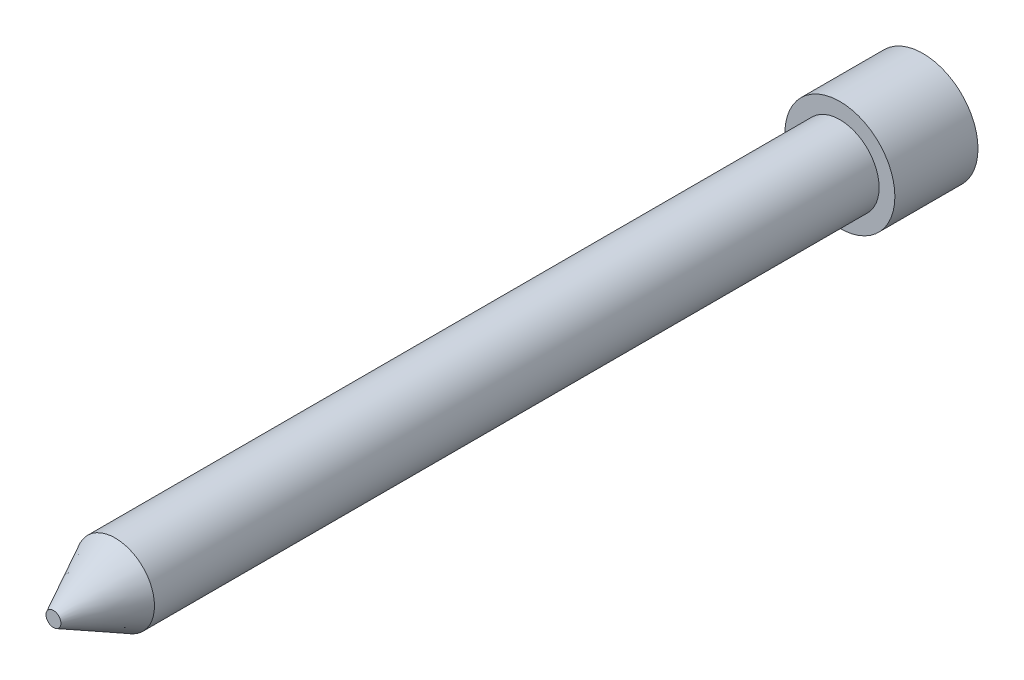
ISO-10303-21;
HEADER;
FILE_DESCRIPTION(('STEP AP214'),'2;1');
FILE_NAME('part.step','',(''),(''),'','','');
FILE_SCHEMA(('AUTOMOTIVE_DESIGN { 1 0 10303 214 1 1 1 1 }'));
ENDSEC;
DATA;
#1=APPLICATION_CONTEXT('core data for automotive mechanical design processes');
#2=APPLICATION_PROTOCOL_DEFINITION('international standard','automotive_design',2000,#1);
#3=PRODUCT_CONTEXT('',#1,'mechanical');
#4=PRODUCT('Part','Part','',(#3));
#5=PRODUCT_RELATED_PRODUCT_CATEGORY('part','',(#4));
#6=PRODUCT_DEFINITION_FORMATION('','',#4);
#7=PRODUCT_DEFINITION_CONTEXT('part definition',#1,'design');
#8=PRODUCT_DEFINITION('design','',#6,#7);
#9=PRODUCT_DEFINITION_SHAPE('','',#8);
#10=(LENGTH_UNIT() NAMED_UNIT(*) SI_UNIT(.MILLI.,.METRE.));
#11=(NAMED_UNIT(*) PLANE_ANGLE_UNIT() SI_UNIT($,.RADIAN.));
#12=(NAMED_UNIT(*) SI_UNIT($,.STERADIAN.) SOLID_ANGLE_UNIT());
#13=UNCERTAINTY_MEASURE_WITH_UNIT(LENGTH_MEASURE(1.E-05),#10,'distance_accuracy_value','');
#14=(GEOMETRIC_REPRESENTATION_CONTEXT(3) GLOBAL_UNCERTAINTY_ASSIGNED_CONTEXT((#13)) GLOBAL_UNIT_ASSIGNED_CONTEXT((#10,
#11,#12)) REPRESENTATION_CONTEXT('',''));
#15=CARTESIAN_POINT('',(0.,0.,0.));
#16=DIRECTION('',(0.,0.,1.));
#17=DIRECTION('',(1.,0.,0.));
#18=AXIS2_PLACEMENT_3D('',#15,#16,#17);
#19=CARTESIAN_POINT('',(41568.2426671962,-10704.098556734,25.908));
#20=DIRECTION('',(0.,0.,-1.));
#21=DIRECTION('',(-1.,0.,0.));
#22=AXIS2_PLACEMENT_3D('',#19,#20,#21);
#23=PLANE('',#22);
#24=CARTESIAN_POINT('',(41568.2426671962,-10704.098556734,25.9080000000154));
#25=DIRECTION('',(0.,0.,-1.));
#26=DIRECTION('',(0.,1.,0.));
#27=AXIS2_PLACEMENT_3D('',#24,#25,#26);
#28=CIRCLE('',#27,0.222249999993096);
#29=CARTESIAN_POINT('',(41568.2426671962,-10703.8763067341,25.9080000000154));
#30=VERTEX_POINT('',#29);
#31=EDGE_CURVE('P0_E30',#30,#30,#28,.T.);
#32=ORIENTED_EDGE('',*,*,#31,.F.);
#33=EDGE_LOOP('',(#32));
#34=FACE_BOUND('',#33,.T.);
#35=ADVANCED_FACE('P0_F14',(#34),#23,.F.);
#36=CARTESIAN_POINT('',(41568.2426671962,-10704.098556734,24.0665000000035));
#37=DIRECTION('',(0.,0.,-1.));
#38=DIRECTION('',(0.,1.,0.));
#39=AXIS2_PLACEMENT_3D('',#36,#37,#38);
#40=CONICAL_SURFACE('',#39,1.1683999999974,0.474621105411241);
#41=CARTESIAN_POINT('',(41568.2426671962,-10704.098556734,24.0665));
#42=DIRECTION('',(0.,0.,1.));
#43=DIRECTION('',(1.,0.,0.));
#44=AXIS2_PLACEMENT_3D('',#41,#42,#43);
#45=CIRCLE('',#44,1.1684);
#46=CARTESIAN_POINT('',(41568.2426671962,-10702.930156734,24.0665));
#47=VERTEX_POINT('',#46);
#48=EDGE_CURVE('P0_E22',#47,#47,#45,.F.);
#49=CARTESIAN_POINT('',(41568.2426671962,-10703.8763067341,25.9080000000154));
#50=CARTESIAN_POINT('',(41568.2426671962,-10703.8664510049,25.8888177083485));
#51=CARTESIAN_POINT('',(41568.2426671962,-10703.8565952757,25.8696354166817));
#52=CARTESIAN_POINT('',(41568.2426671962,-10703.8368838174,25.8312708333481));
#53=CARTESIAN_POINT('',(41568.2426671962,-10703.8270280882,25.8120885416812));
#54=CARTESIAN_POINT('',(41568.2426671962,-10703.8073166299,25.7737239583476));
#55=CARTESIAN_POINT('',(41568.2426671962,-10703.7974609007,25.7545416666807));
#56=CARTESIAN_POINT('',(41568.2426671962,-10703.7777494424,25.7161770833471));
#57=CARTESIAN_POINT('',(41568.2426671962,-10703.7678937132,25.6969947916803));
#58=CARTESIAN_POINT('',(41568.2426671962,-10703.7481822549,25.6586302083466));
#59=CARTESIAN_POINT('',(41568.2426671962,-10703.7383265257,25.6394479166798));
#60=CARTESIAN_POINT('',(41568.2426671962,-10703.7186150674,25.6010833333461));
#61=CARTESIAN_POINT('',(41568.2426671962,-10703.7087593382,25.5819010416793));
#62=CARTESIAN_POINT('',(41568.2426671962,-10703.6890478799,25.5435364583457));
#63=CARTESIAN_POINT('',(41568.2426671962,-10703.6791921507,25.5243541666788));
#64=CARTESIAN_POINT('',(41568.2426671962,-10703.6594806924,25.4859895833452));
#65=CARTESIAN_POINT('',(41568.2426671962,-10703.6496249632,25.4668072916783));
#66=CARTESIAN_POINT('',(41568.2426671962,-10703.6299135049,25.4284427083447));
#67=CARTESIAN_POINT('',(41568.2426671962,-10703.6200577757,25.4092604166779));
#68=CARTESIAN_POINT('',(41568.2426671962,-10703.6003463174,25.3708958333442));
#69=CARTESIAN_POINT('',(41568.2426671962,-10703.5904905882,25.3517135416774));
#70=CARTESIAN_POINT('',(41568.2426671962,-10703.5707791299,25.3133489583437));
#71=CARTESIAN_POINT('',(41568.2426671962,-10703.5609234007,25.2941666666769));
#72=CARTESIAN_POINT('',(41568.2426671962,-10703.5412119424,25.2558020833433));
#73=CARTESIAN_POINT('',(41568.2426671962,-10703.5313562132,25.2366197916764));
#74=CARTESIAN_POINT('',(41568.2426671962,-10703.5116447549,25.1982552083428));
#75=CARTESIAN_POINT('',(41568.2426671962,-10703.5017890257,25.1790729166759));
#76=CARTESIAN_POINT('',(41568.2426671962,-10703.4820775674,25.1407083333423));
#77=CARTESIAN_POINT('',(41568.2426671962,-10703.4722218382,25.1215260416755));
#78=CARTESIAN_POINT('',(41568.2426671962,-10703.4525103799,25.0831614583418));
#79=CARTESIAN_POINT('',(41568.2426671962,-10703.4426546507,25.0639791666748));
#80=CARTESIAN_POINT('',(41568.2426671962,-10703.4229431924,25.0256145833412));
#81=CARTESIAN_POINT('',(41568.2426671962,-10703.4130874632,25.0064322916746));
#82=CARTESIAN_POINT('',(41568.2426671962,-10703.3933760049,24.968067708341));
#83=CARTESIAN_POINT('',(41568.2426671962,-10703.3835202757,24.9488854166741));
#84=CARTESIAN_POINT('',(41568.2426671962,-10703.3638088174,24.9105208333403));
#85=CARTESIAN_POINT('',(41568.2426671962,-10703.3539530882,24.8913385416735));
#86=CARTESIAN_POINT('',(41568.2426671962,-10703.3342416299,24.8529739583399));
#87=CARTESIAN_POINT('',(41568.2426671962,-10703.3243859007,24.8337916666731));
#88=CARTESIAN_POINT('',(41568.2426671962,-10703.3046744424,24.7954270833394));
#89=CARTESIAN_POINT('',(41568.2426671962,-10703.2948187132,24.7762447916726));
#90=CARTESIAN_POINT('',(41568.2426671962,-10703.2751072549,24.7378802083389));
#91=CARTESIAN_POINT('',(41568.2426671962,-10703.2652515257,24.7186979166721));
#92=CARTESIAN_POINT('',(41568.2426671962,-10703.2455400674,24.6803333333385));
#93=CARTESIAN_POINT('',(41568.2426671962,-10703.2356843382,24.6611510416716));
#94=CARTESIAN_POINT('',(41568.2426671962,-10703.2159728799,24.622786458338));
#95=CARTESIAN_POINT('',(41568.2426671962,-10703.2061171507,24.6036041666711));
#96=CARTESIAN_POINT('',(41568.2426671962,-10703.1864056924,24.5652395833375));
#97=CARTESIAN_POINT('',(41568.2426671962,-10703.1765499632,24.5460572916707));
#98=CARTESIAN_POINT('',(41568.2426671962,-10703.1568385049,24.507692708337));
#99=CARTESIAN_POINT('',(41568.2426671962,-10703.1469827757,24.4885104166702));
#100=CARTESIAN_POINT('',(41568.2426671962,-10703.1272713174,24.4501458333365));
#101=CARTESIAN_POINT('',(41568.2426671962,-10703.1174155882,24.4309635416697));
#102=CARTESIAN_POINT('',(41568.2426671962,-10703.0977041299,24.3925989583361));
#103=CARTESIAN_POINT('',(41568.2426671962,-10703.0878484007,24.3734166666692));
#104=CARTESIAN_POINT('',(41568.2426671962,-10703.0681369424,24.3350520833356));
#105=CARTESIAN_POINT('',(41568.2426671962,-10703.0582812132,24.3158697916687));
#106=CARTESIAN_POINT('',(41568.2426671962,-10703.0385697549,24.2775052083351));
#107=CARTESIAN_POINT('',(41568.2426671962,-10703.0287140257,24.2583229166683));
#108=CARTESIAN_POINT('',(41568.2426671962,-10703.0090025674,24.2199583333346));
#109=CARTESIAN_POINT('',(41568.2426671962,-10702.9991468382,24.2007760416678));
#110=CARTESIAN_POINT('',(41568.2426671962,-10702.9794353799,24.1624114583341));
#111=CARTESIAN_POINT('',(41568.2426671962,-10702.9695796507,24.1432291666673));
#112=CARTESIAN_POINT('',(41568.2426671962,-10702.9498681924,24.1048645833337));
#113=CARTESIAN_POINT('',(41568.2426671962,-10702.9400124632,24.0856822916668));
#114=CARTESIAN_POINT('',(41568.2426671962,-10702.930156734,24.0665));
#115=B_SPLINE_CURVE_WITH_KNOTS('',3,(#49,#50,#51,#52,#53,#54,#55,#56,#57,#58,#59,#60,#61,#62,
#63,#64,#65,#66,#67,#68,#69,#70,#71,#72,#73,#74,#75,#76,#77,#78,#79,#80,#81,#82,#83,#84,#85,#86,
#87,#88,#89,#90,#91,#92,#93,#94,#95,#96,#97,#98,#99,#100,#101,#102,#103,#104,#105,#106,#107,
#108,#109,#110,#111,#112,#113,#114),.UNSPECIFIED.,.F.,.F.,(4,2,2,2,2,2,2,2,2,2,2,2,2,2,2,2,2,2,
2,2,2,2,2,2,2,2,2,2,2,2,2,2,4),(0.,0.0646982333529211,0.129396466705842,0.194094700058763,
0.258792933411684,0.323491166764606,0.388189400117527,0.452887633470448,0.517585866823369,
0.58228410017629,0.646982333529211,0.711680566882132,0.77637880023505,0.841077033587972,
0.905775266940893,0.970473500293814,1.03517173364755,1.09986996700047,1.16456820035339,
1.22926643370631,1.29396466705923,1.35866290041215,1.42336113376507,1.48805936711799,
1.55275760047091,1.61745583382383,1.68215406717676,1.74685230052968,1.8115505338826,
1.87624876723552,1.94094700058844,2.00564523394136,2.07034346729428),.UNSPECIFIED.);
#116=EDGE_CURVE('P0_BSEAM41',#30,#47,#115,.T.);
#117=ORIENTED_EDGE('',*,*,#31,.T.);
#118=ORIENTED_EDGE('',*,*,#48,.F.);
#119=ORIENTED_EDGE('',*,*,#116,.T.);
#120=ORIENTED_EDGE('',*,*,#116,.F.);
#121=EDGE_LOOP('',(#117,#119,#118,#120));
#122=FACE_BOUND('',#121,.T.);
#123=ADVANCED_FACE('P0_F41',(#122),#40,.T.);
#124=CARTESIAN_POINT('',(41568.2426671962,-10704.098556734,2.4765));
#125=DIRECTION('',(0.,0.,1.));
#126=DIRECTION('',(1.,0.,0.));
#127=AXIS2_PLACEMENT_3D('',#124,#125,#126);
#128=PLANE('',#127);
#129=CARTESIAN_POINT('',(41568.2426671962,-10704.098556734,2.4765));
#130=DIRECTION('',(0.,0.,1.));
#131=DIRECTION('',(1.,0.,0.));
#132=AXIS2_PLACEMENT_3D('',#129,#130,#131);
#133=CIRCLE('',#132,1.1684);
#134=CARTESIAN_POINT('',(41569.4110671962,-10704.098556734,2.4765));
#135=VERTEX_POINT('',#134);
#136=EDGE_CURVE('P0_E10',#135,#135,#133,.T.);
#137=ORIENTED_EDGE('',*,*,#136,.F.);
#138=EDGE_LOOP('',(#137));
#139=FACE_BOUND('',#138,.T.);
#140=ADVANCED_FACE('P0_F49',(#139),#128,.F.);
#141=CARTESIAN_POINT('',(41568.2426671962,-10704.098556734,2.4765));
#142=DIRECTION('',(0.,0.,1.));
#143=DIRECTION('',(1.,0.,0.));
#144=AXIS2_PLACEMENT_3D('',#141,#142,#143);
#145=CYLINDRICAL_SURFACE('',#144,1.1684);
#146=ORIENTED_EDGE('',*,*,#136,.T.);
#147=EDGE_LOOP('',(#146));
#148=FACE_BOUND('',#147,.T.);
#149=ORIENTED_EDGE('',*,*,#48,.T.);
#150=EDGE_LOOP('',(#149));
#151=FACE_BOUND('',#150,.T.);
#152=ADVANCED_FACE('P0_F50',(#148,#151),#145,.T.);
#153=CLOSED_SHELL('',(#35,#123,#140,#152));
#154=MANIFOLD_SOLID_BREP('P0_B1',#153);
#155=CARTESIAN_POINT('',(41568.2426671962,-10704.098556734,2.4765));
#156=DIRECTION('',(0.,0.,1.));
#157=DIRECTION('',(1.,0.,0.));
#158=AXIS2_PLACEMENT_3D('',#155,#156,#157);
#159=PLANE('',#158);
#160=CARTESIAN_POINT('',(41568.2426671962,-10704.098556734,2.4765));
#161=DIRECTION('',(0.,0.,1.));
#162=DIRECTION('',(1.,0.,0.));
#163=AXIS2_PLACEMENT_3D('',#160,#161,#162);
#164=CIRCLE('',#163,1.6383);
#165=CARTESIAN_POINT('',(41569.8809671962,-10704.098556734,2.4765));
#166=VERTEX_POINT('',#165);
#167=EDGE_CURVE('P1_E22',#166,#166,#164,.F.);
#168=ORIENTED_EDGE('',*,*,#167,.F.);
#169=EDGE_LOOP('',(#168));
#170=FACE_BOUND('',#169,.T.);
#171=ADVANCED_FACE('P1_F14',(#170),#159,.T.);
#172=CARTESIAN_POINT('',(41568.2426671962,-10704.098556734,0.));
#173=DIRECTION('',(0.,0.,1.));
#174=DIRECTION('',(1.,0.,0.));
#175=AXIS2_PLACEMENT_3D('',#172,#173,#174);
#176=PLANE('',#175);
#177=CARTESIAN_POINT('',(41568.2426671962,-10704.098556734,0.));
#178=DIRECTION('',(0.,0.,1.));
#179=DIRECTION('',(1.,0.,0.));
#180=AXIS2_PLACEMENT_3D('',#177,#178,#179);
#181=CIRCLE('',#180,1.6383);
#182=CARTESIAN_POINT('',(41569.8809671962,-10704.098556734,0.));
#183=VERTEX_POINT('',#182);
#184=EDGE_CURVE('P1_E10',#183,#183,#181,.T.);
#185=ORIENTED_EDGE('',*,*,#184,.F.);
#186=EDGE_LOOP('',(#185));
#187=FACE_BOUND('',#186,.T.);
#188=ADVANCED_FACE('P1_F38',(#187),#176,.F.);
#189=CARTESIAN_POINT('',(41568.2426671962,-10704.098556734,0.));
#190=DIRECTION('',(0.,0.,1.));
#191=DIRECTION('',(1.,0.,0.));
#192=AXIS2_PLACEMENT_3D('',#189,#190,#191);
#193=CYLINDRICAL_SURFACE('',#192,1.6383);
#194=ORIENTED_EDGE('',*,*,#184,.T.);
#195=EDGE_LOOP('',(#194));
#196=FACE_BOUND('',#195,.T.);
#197=ORIENTED_EDGE('',*,*,#167,.T.);
#198=EDGE_LOOP('',(#197));
#199=FACE_BOUND('',#198,.T.);
#200=ADVANCED_FACE('P1_F35',(#196,#199),#193,.T.);
#201=CLOSED_SHELL('',(#171,#188,#200));
#202=MANIFOLD_SOLID_BREP('P1_B1',#201);
#203=ADVANCED_BREP_SHAPE_REPRESENTATION('',(#18,#154,#202),#14);
#204=SHAPE_DEFINITION_REPRESENTATION(#9,#203);
ENDSEC;
END-ISO-10303-21;
